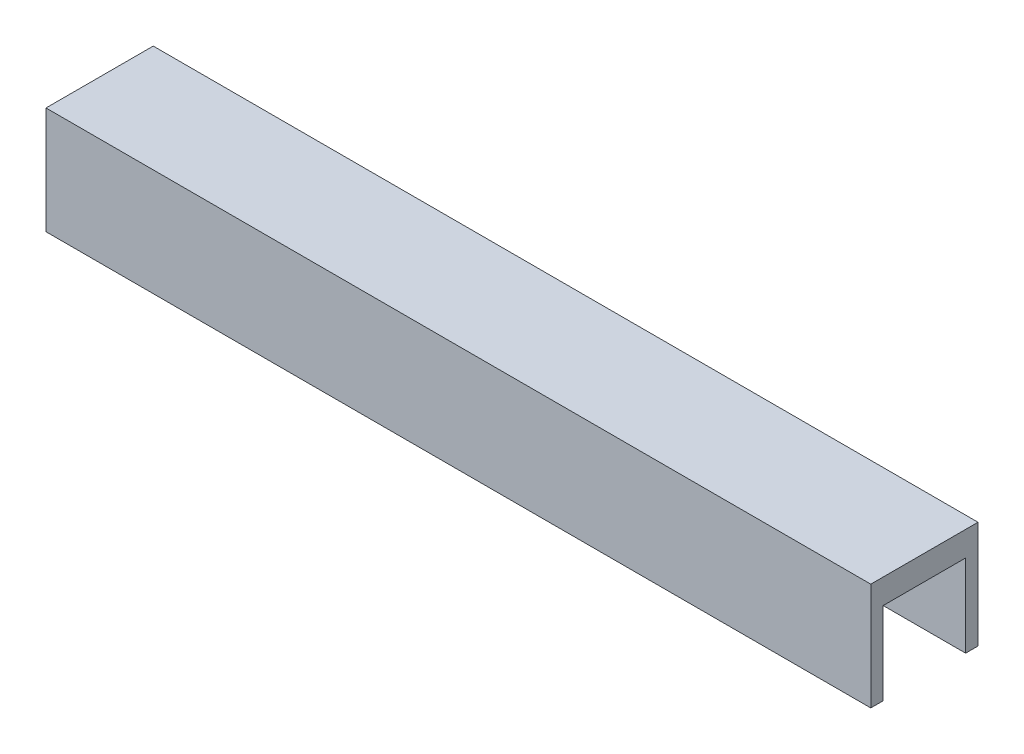
ISO-10303-21;
HEADER;
FILE_DESCRIPTION(('STEP AP214'),'2;1');
FILE_NAME('part.step','',(''),(''),'','','');
FILE_SCHEMA(('AUTOMOTIVE_DESIGN { 1 0 10303 214 1 1 1 1 }'));
ENDSEC;
DATA;
#1=APPLICATION_CONTEXT('core data for automotive mechanical design processes');
#2=APPLICATION_PROTOCOL_DEFINITION('international standard','automotive_design',2000,#1);
#3=PRODUCT_CONTEXT('',#1,'mechanical');
#4=PRODUCT('Part','Part','',(#3));
#5=PRODUCT_RELATED_PRODUCT_CATEGORY('part','',(#4));
#6=PRODUCT_DEFINITION_FORMATION('','',#4);
#7=PRODUCT_DEFINITION_CONTEXT('part definition',#1,'design');
#8=PRODUCT_DEFINITION('design','',#6,#7);
#9=PRODUCT_DEFINITION_SHAPE('','',#8);
#10=(LENGTH_UNIT() NAMED_UNIT(*) SI_UNIT(.MILLI.,.METRE.));
#11=(NAMED_UNIT(*) PLANE_ANGLE_UNIT() SI_UNIT($,.RADIAN.));
#12=(NAMED_UNIT(*) SI_UNIT($,.STERADIAN.) SOLID_ANGLE_UNIT());
#13=UNCERTAINTY_MEASURE_WITH_UNIT(LENGTH_MEASURE(1.E-05),#10,'distance_accuracy_value','');
#14=(GEOMETRIC_REPRESENTATION_CONTEXT(3) GLOBAL_UNCERTAINTY_ASSIGNED_CONTEXT((#13)) GLOBAL_UNIT_ASSIGNED_CONTEXT((#10,
#11,#12)) REPRESENTATION_CONTEXT('',''));
#15=CARTESIAN_POINT('',(0.,0.,0.));
#16=DIRECTION('',(0.,0.,1.));
#17=DIRECTION('',(1.,0.,0.));
#18=AXIS2_PLACEMENT_3D('',#15,#16,#17);
#19=CARTESIAN_POINT('',(0.,0.,0.));
#20=DIRECTION('',(0.,-1.,0.));
#21=DIRECTION('',(0.,0.,-1.));
#22=AXIS2_PLACEMENT_3D('',#19,#20,#21);
#23=PLANE('',#22);
#24=DIRECTION('',(-1.,0.,0.));
#25=VECTOR('',#24,1.);
#26=CARTESIAN_POINT('',(0.,0.,5.));
#27=LINE('',#26,#25);
#28=CARTESIAN_POINT('',(50.,0.,5.));
#29=VERTEX_POINT('',#28);
#30=CARTESIAN_POINT('',(-50.,0.,5.));
#31=VERTEX_POINT('',#30);
#32=EDGE_CURVE('E11',#29,#31,#27,.T.);
#33=ORIENTED_EDGE('',*,*,#32,.F.);
#34=DIRECTION('',(0.,0.,-1.));
#35=VECTOR('',#34,1.);
#36=CARTESIAN_POINT('',(50.,0.,6.5));
#37=LINE('',#36,#35);
#38=CARTESIAN_POINT('',(50.,0.,6.5));
#39=VERTEX_POINT('',#38);
#40=EDGE_CURVE('E161',#39,#29,#37,.T.);
#41=ORIENTED_EDGE('',*,*,#40,.F.);
#42=DIRECTION('',(1.,0.,0.));
#43=VECTOR('',#42,1.);
#44=CARTESIAN_POINT('',(-50.,0.,6.5));
#45=LINE('',#44,#43);
#46=CARTESIAN_POINT('',(-50.,0.,6.5));
#47=VERTEX_POINT('',#46);
#48=EDGE_CURVE('E85',#47,#39,#45,.T.);
#49=ORIENTED_EDGE('',*,*,#48,.F.);
#50=DIRECTION('',(0.,0.,1.));
#51=VECTOR('',#50,1.);
#52=CARTESIAN_POINT('',(-50.,0.,6.5));
#53=LINE('',#52,#51);
#54=EDGE_CURVE('E167',#31,#47,#53,.T.);
#55=ORIENTED_EDGE('',*,*,#54,.F.);
#56=EDGE_LOOP('',(#33,#41,#49,#55));
#57=FACE_BOUND('',#56,.T.);
#58=ADVANCED_FACE('F39',(#57),#23,.T.);
#59=CARTESIAN_POINT('',(50.,13.,6.5));
#60=DIRECTION('',(-1.,0.,0.));
#61=DIRECTION('',(0.,0.,1.));
#62=AXIS2_PLACEMENT_3D('',#59,#60,#61);
#63=PLANE('',#62);
#64=ORIENTED_EDGE('',*,*,#40,.T.);
#65=DIRECTION('',(0.,1.,0.));
#66=VECTOR('',#65,1.);
#67=CARTESIAN_POINT('',(50.,-3.,5.));
#68=LINE('',#67,#66);
#69=CARTESIAN_POINT('',(50.,10.,5.));
#70=VERTEX_POINT('',#69);
#71=EDGE_CURVE('E134',#29,#70,#68,.T.);
#72=ORIENTED_EDGE('',*,*,#71,.T.);
#73=DIRECTION('',(0.,0.,-1.));
#74=VECTOR('',#73,1.);
#75=CARTESIAN_POINT('',(50.,10.,5.));
#76=LINE('',#75,#74);
#77=CARTESIAN_POINT('',(50.,10.,-5.));
#78=VERTEX_POINT('',#77);
#79=EDGE_CURVE('E126',#70,#78,#76,.T.);
#80=ORIENTED_EDGE('',*,*,#79,.T.);
#81=DIRECTION('',(0.,1.,0.));
#82=VECTOR('',#81,1.);
#83=CARTESIAN_POINT('',(50.,-3.,-5.));
#84=LINE('',#83,#82);
#85=CARTESIAN_POINT('',(50.,0.,-5.));
#86=VERTEX_POINT('',#85);
#87=EDGE_CURVE('E113',#86,#78,#84,.T.);
#88=ORIENTED_EDGE('',*,*,#87,.F.);
#89=CARTESIAN_POINT('',(50.,0.,-6.5));
#90=VERTEX_POINT('',#89);
#91=EDGE_CURVE('E144',#86,#90,#37,.T.);
#92=ORIENTED_EDGE('',*,*,#91,.T.);
#93=DIRECTION('',(0.,-1.,0.));
#94=VECTOR('',#93,1.);
#95=CARTESIAN_POINT('',(50.,13.,-6.5));
#96=LINE('',#95,#94);
#97=CARTESIAN_POINT('',(50.,13.,-6.5));
#98=VERTEX_POINT('',#97);
#99=EDGE_CURVE('E183',#98,#90,#96,.T.);
#100=ORIENTED_EDGE('',*,*,#99,.F.);
#101=DIRECTION('',(0.,0.,-1.));
#102=VECTOR('',#101,1.);
#103=CARTESIAN_POINT('',(50.,13.,6.5));
#104=LINE('',#103,#102);
#105=CARTESIAN_POINT('',(50.,13.,6.5));
#106=VERTEX_POINT('',#105);
#107=EDGE_CURVE('E150',#106,#98,#104,.T.);
#108=ORIENTED_EDGE('',*,*,#107,.F.);
#109=DIRECTION('',(0.,-1.,0.));
#110=VECTOR('',#109,1.);
#111=CARTESIAN_POINT('',(50.,13.,6.5));
#112=LINE('',#111,#110);
#113=EDGE_CURVE('E160',#106,#39,#112,.T.);
#114=ORIENTED_EDGE('',*,*,#113,.T.);
#115=EDGE_LOOP('',(#64,#72,#80,#88,#92,#100,#108,#114));
#116=FACE_BOUND('',#115,.T.);
#117=ADVANCED_FACE('F41',(#116),#63,.F.);
#118=CARTESIAN_POINT('',(-50.,13.,-6.5));
#119=DIRECTION('',(0.,0.,1.));
#120=DIRECTION('',(1.,0.,0.));
#121=AXIS2_PLACEMENT_3D('',#118,#119,#120);
#122=PLANE('',#121);
#123=DIRECTION('',(-1.,0.,0.));
#124=VECTOR('',#123,1.);
#125=CARTESIAN_POINT('',(-50.,0.,-6.5));
#126=LINE('',#125,#124);
#127=CARTESIAN_POINT('',(-50.,0.,-6.5));
#128=VERTEX_POINT('',#127);
#129=EDGE_CURVE('E164',#90,#128,#126,.T.);
#130=ORIENTED_EDGE('',*,*,#129,.T.);
#131=DIRECTION('',(0.,-1.,0.));
#132=VECTOR('',#131,1.);
#133=CARTESIAN_POINT('',(-50.,13.,-6.5));
#134=LINE('',#133,#132);
#135=CARTESIAN_POINT('',(-50.,13.,-6.5));
#136=VERTEX_POINT('',#135);
#137=EDGE_CURVE('E179',#136,#128,#134,.T.);
#138=ORIENTED_EDGE('',*,*,#137,.F.);
#139=DIRECTION('',(-1.,0.,0.));
#140=VECTOR('',#139,1.);
#141=CARTESIAN_POINT('',(-50.,13.,-6.5));
#142=LINE('',#141,#140);
#143=EDGE_CURVE('E93',#98,#136,#142,.T.);
#144=ORIENTED_EDGE('',*,*,#143,.F.);
#145=ORIENTED_EDGE('',*,*,#99,.T.);
#146=EDGE_LOOP('',(#130,#138,#144,#145));
#147=FACE_BOUND('',#146,.T.);
#148=ADVANCED_FACE('F194',(#147),#122,.F.);
#149=CARTESIAN_POINT('',(-50.,13.,6.5));
#150=DIRECTION('',(1.,0.,0.));
#151=DIRECTION('',(0.,0.,-1.));
#152=AXIS2_PLACEMENT_3D('',#149,#150,#151);
#153=PLANE('',#152);
#154=DIRECTION('',(0.,0.,1.));
#155=VECTOR('',#154,1.);
#156=CARTESIAN_POINT('',(-50.,10.,5.));
#157=LINE('',#156,#155);
#158=CARTESIAN_POINT('',(-50.,10.,-5.));
#159=VERTEX_POINT('',#158);
#160=CARTESIAN_POINT('',(-50.,10.,5.));
#161=VERTEX_POINT('',#160);
#162=EDGE_CURVE('E129',#159,#161,#157,.T.);
#163=ORIENTED_EDGE('',*,*,#162,.T.);
#164=DIRECTION('',(0.,1.,0.));
#165=VECTOR('',#164,1.);
#166=CARTESIAN_POINT('',(-50.,-3.,5.));
#167=LINE('',#166,#165);
#168=EDGE_CURVE('E145',#31,#161,#167,.T.);
#169=ORIENTED_EDGE('',*,*,#168,.F.);
#170=ORIENTED_EDGE('',*,*,#54,.T.);
#171=DIRECTION('',(0.,-1.,0.));
#172=VECTOR('',#171,1.);
#173=CARTESIAN_POINT('',(-50.,13.,6.5));
#174=LINE('',#173,#172);
#175=CARTESIAN_POINT('',(-50.,13.,6.5));
#176=VERTEX_POINT('',#175);
#177=EDGE_CURVE('E176',#176,#47,#174,.T.);
#178=ORIENTED_EDGE('',*,*,#177,.F.);
#179=DIRECTION('',(0.,0.,1.));
#180=VECTOR('',#179,1.);
#181=CARTESIAN_POINT('',(-50.,13.,6.5));
#182=LINE('',#181,#180);
#183=EDGE_CURVE('E155',#136,#176,#182,.T.);
#184=ORIENTED_EDGE('',*,*,#183,.F.);
#185=ORIENTED_EDGE('',*,*,#137,.T.);
#186=CARTESIAN_POINT('',(-50.,0.,-5.));
#187=VERTEX_POINT('',#186);
#188=EDGE_CURVE('E168',#128,#187,#53,.T.);
#189=ORIENTED_EDGE('',*,*,#188,.T.);
#190=DIRECTION('',(0.,1.,0.));
#191=VECTOR('',#190,1.);
#192=CARTESIAN_POINT('',(-50.,-3.,-5.));
#193=LINE('',#192,#191);
#194=EDGE_CURVE('E55',#187,#159,#193,.T.);
#195=ORIENTED_EDGE('',*,*,#194,.T.);
#196=EDGE_LOOP('',(#163,#169,#170,#178,#184,#185,#189,#195));
#197=FACE_BOUND('',#196,.T.);
#198=ADVANCED_FACE('F196',(#197),#153,.F.);
#199=CARTESIAN_POINT('',(-50.,13.,6.5));
#200=DIRECTION('',(0.,0.,-1.));
#201=DIRECTION('',(-1.,0.,0.));
#202=AXIS2_PLACEMENT_3D('',#199,#200,#201);
#203=PLANE('',#202);
#204=ORIENTED_EDGE('',*,*,#48,.T.);
#205=ORIENTED_EDGE('',*,*,#113,.F.);
#206=DIRECTION('',(1.,0.,0.));
#207=VECTOR('',#206,1.);
#208=CARTESIAN_POINT('',(-50.,13.,6.5));
#209=LINE('',#208,#207);
#210=EDGE_CURVE('E64',#176,#106,#209,.T.);
#211=ORIENTED_EDGE('',*,*,#210,.F.);
#212=ORIENTED_EDGE('',*,*,#177,.T.);
#213=EDGE_LOOP('',(#204,#205,#211,#212));
#214=FACE_BOUND('',#213,.T.);
#215=ADVANCED_FACE('F201',(#214),#203,.F.);
#216=CARTESIAN_POINT('',(0.,13.,0.));
#217=DIRECTION('',(0.,-1.,0.));
#218=DIRECTION('',(0.,0.,-1.));
#219=AXIS2_PLACEMENT_3D('',#216,#217,#218);
#220=PLANE('',#219);
#221=ORIENTED_EDGE('',*,*,#107,.T.);
#222=ORIENTED_EDGE('',*,*,#143,.T.);
#223=ORIENTED_EDGE('',*,*,#183,.T.);
#224=ORIENTED_EDGE('',*,*,#210,.T.);
#225=EDGE_LOOP('',(#221,#222,#223,#224));
#226=FACE_BOUND('',#225,.T.);
#227=ADVANCED_FACE('F214',(#226),#220,.F.);
#228=DIRECTION('',(1.,0.,0.));
#229=VECTOR('',#228,1.);
#230=CARTESIAN_POINT('',(0.,0.,-5.));
#231=LINE('',#230,#229);
#232=EDGE_CURVE('E48',#187,#86,#231,.T.);
#233=ORIENTED_EDGE('',*,*,#232,.F.);
#234=ORIENTED_EDGE('',*,*,#188,.F.);
#235=ORIENTED_EDGE('',*,*,#129,.F.);
#236=ORIENTED_EDGE('',*,*,#91,.F.);
#237=EDGE_LOOP('',(#233,#234,#235,#236));
#238=FACE_BOUND('',#237,.T.);
#239=ADVANCED_FACE('F193',(#238),#23,.T.);
#240=CARTESIAN_POINT('',(-50.,-3.,5.));
#241=DIRECTION('',(0.,0.,1.));
#242=DIRECTION('',(1.,0.,0.));
#243=AXIS2_PLACEMENT_3D('',#240,#241,#242);
#244=PLANE('',#243);
#245=ORIENTED_EDGE('',*,*,#32,.T.);
#246=ORIENTED_EDGE('',*,*,#168,.T.);
#247=DIRECTION('',(1.,0.,0.));
#248=VECTOR('',#247,1.);
#249=CARTESIAN_POINT('',(-50.,10.,5.));
#250=LINE('',#249,#248);
#251=EDGE_CURVE('E121',#161,#70,#250,.T.);
#252=ORIENTED_EDGE('',*,*,#251,.T.);
#253=ORIENTED_EDGE('',*,*,#71,.F.);
#254=EDGE_LOOP('',(#245,#246,#252,#253));
#255=FACE_BOUND('',#254,.T.);
#256=ADVANCED_FACE('F213',(#255),#244,.F.);
#257=CARTESIAN_POINT('',(-50.,-3.,-5.));
#258=DIRECTION('',(0.,0.,-1.));
#259=DIRECTION('',(-1.,0.,0.));
#260=AXIS2_PLACEMENT_3D('',#257,#258,#259);
#261=PLANE('',#260);
#262=ORIENTED_EDGE('',*,*,#232,.T.);
#263=ORIENTED_EDGE('',*,*,#87,.T.);
#264=DIRECTION('',(-1.,0.,0.));
#265=VECTOR('',#264,1.);
#266=CARTESIAN_POINT('',(-50.,10.,-5.));
#267=LINE('',#266,#265);
#268=EDGE_CURVE('E116',#78,#159,#267,.T.);
#269=ORIENTED_EDGE('',*,*,#268,.T.);
#270=ORIENTED_EDGE('',*,*,#194,.F.);
#271=EDGE_LOOP('',(#262,#263,#269,#270));
#272=FACE_BOUND('',#271,.T.);
#273=ADVANCED_FACE('F115',(#272),#261,.F.);
#274=CARTESIAN_POINT('',(0.,10.,0.));
#275=DIRECTION('',(0.,-1.,0.));
#276=DIRECTION('',(0.,0.,-1.));
#277=AXIS2_PLACEMENT_3D('',#274,#275,#276);
#278=PLANE('',#277);
#279=ORIENTED_EDGE('',*,*,#79,.F.);
#280=ORIENTED_EDGE('',*,*,#251,.F.);
#281=ORIENTED_EDGE('',*,*,#162,.F.);
#282=ORIENTED_EDGE('',*,*,#268,.F.);
#283=EDGE_LOOP('',(#279,#280,#281,#282));
#284=FACE_BOUND('',#283,.T.);
#285=ADVANCED_FACE('F124',(#284),#278,.T.);
#286=CLOSED_SHELL('',(#58,#117,#148,#198,#215,#227,#239,#256,#273,#285));
#287=MANIFOLD_SOLID_BREP('B2',#286);
#288=ADVANCED_BREP_SHAPE_REPRESENTATION('',(#18,#287),#14);
#289=SHAPE_DEFINITION_REPRESENTATION(#9,#288);
ENDSEC;
END-ISO-10303-21;
